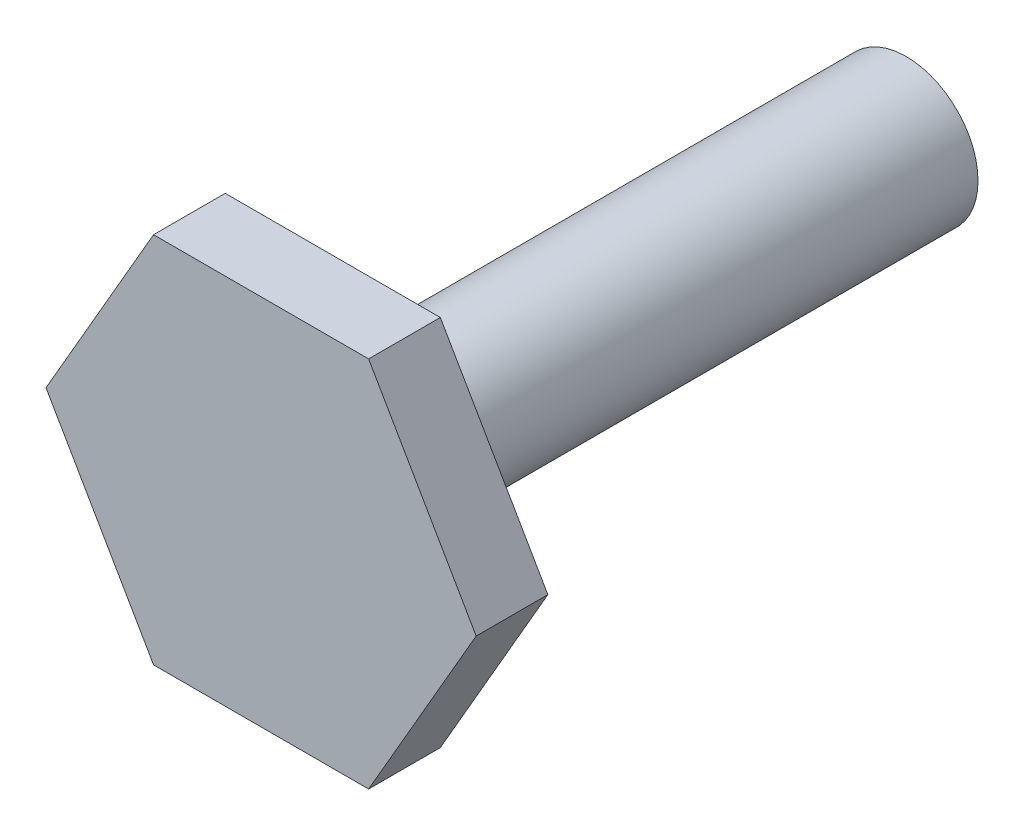
ISO-10303-21;
HEADER;
FILE_DESCRIPTION(('STEP AP214'),'2;1');
FILE_NAME('part.step','',(''),(''),'','','');
FILE_SCHEMA(('AUTOMOTIVE_DESIGN { 1 0 10303 214 1 1 1 1 }'));
ENDSEC;
DATA;
#1=APPLICATION_CONTEXT('core data for automotive mechanical design processes');
#2=APPLICATION_PROTOCOL_DEFINITION('international standard','automotive_design',2000,#1);
#3=PRODUCT_CONTEXT('',#1,'mechanical');
#4=PRODUCT('Part','Part','',(#3));
#5=PRODUCT_RELATED_PRODUCT_CATEGORY('part','',(#4));
#6=PRODUCT_DEFINITION_FORMATION('','',#4);
#7=PRODUCT_DEFINITION_CONTEXT('part definition',#1,'design');
#8=PRODUCT_DEFINITION('design','',#6,#7);
#9=PRODUCT_DEFINITION_SHAPE('','',#8);
#10=(LENGTH_UNIT() NAMED_UNIT(*) SI_UNIT(.MILLI.,.METRE.));
#11=(NAMED_UNIT(*) PLANE_ANGLE_UNIT() SI_UNIT($,.RADIAN.));
#12=(NAMED_UNIT(*) SI_UNIT($,.STERADIAN.) SOLID_ANGLE_UNIT());
#13=UNCERTAINTY_MEASURE_WITH_UNIT(LENGTH_MEASURE(1.E-05),#10,'distance_accuracy_value','');
#14=(GEOMETRIC_REPRESENTATION_CONTEXT(3) GLOBAL_UNCERTAINTY_ASSIGNED_CONTEXT((#13)) GLOBAL_UNIT_ASSIGNED_CONTEXT((#10,
#11,#12)) REPRESENTATION_CONTEXT('',''));
#15=CARTESIAN_POINT('',(0.,0.,0.));
#16=DIRECTION('',(0.,0.,1.));
#17=DIRECTION('',(1.,0.,0.));
#18=AXIS2_PLACEMENT_3D('',#15,#16,#17);
#19=CARTESIAN_POINT('',(0.,0.,12.7));
#20=DIRECTION('',(0.,0.,-1.));
#21=DIRECTION('',(-1.,0.,0.));
#22=AXIS2_PLACEMENT_3D('',#19,#20,#21);
#23=CYLINDRICAL_SURFACE('',#22,3.175);
#24=CARTESIAN_POINT('',(0.,0.,12.7));
#25=DIRECTION('',(0.,0.,1.));
#26=DIRECTION('',(1.,0.,0.));
#27=AXIS2_PLACEMENT_3D('',#24,#25,#26);
#28=CIRCLE('',#27,3.175);
#29=CARTESIAN_POINT('',(3.175,0.,12.7));
#30=VERTEX_POINT('',#29);
#31=EDGE_CURVE('E11',#30,#30,#28,.T.);
#32=ORIENTED_EDGE('',*,*,#31,.F.);
#33=EDGE_LOOP('',(#32));
#34=FACE_BOUND('',#33,.T.);
#35=CARTESIAN_POINT('',(0.,0.,-12.7));
#36=DIRECTION('',(0.,0.,1.));
#37=DIRECTION('',(1.,0.,0.));
#38=AXIS2_PLACEMENT_3D('',#35,#36,#37);
#39=CIRCLE('',#38,3.175);
#40=CARTESIAN_POINT('',(3.175,0.,-12.7));
#41=VERTEX_POINT('',#40);
#42=EDGE_CURVE('E48',#41,#41,#39,.T.);
#43=ORIENTED_EDGE('',*,*,#42,.T.);
#44=EDGE_LOOP('',(#43));
#45=FACE_BOUND('',#44,.T.);
#46=ADVANCED_FACE('F45',(#34,#45),#23,.T.);
#47=CARTESIAN_POINT('',(0.,0.,-12.7));
#48=DIRECTION('',(0.,0.,1.));
#49=DIRECTION('',(1.,0.,0.));
#50=AXIS2_PLACEMENT_3D('',#47,#48,#49);
#51=PLANE('',#50);
#52=ORIENTED_EDGE('',*,*,#42,.F.);
#53=EDGE_LOOP('',(#52));
#54=FACE_BOUND('',#53,.T.);
#55=ADVANCED_FACE('F170',(#54),#51,.F.);
#56=CARTESIAN_POINT('',(4.7625,-8.24889197104678,15.875));
#57=DIRECTION('',(-0.866025403784439,0.5,0.));
#58=DIRECTION('',(-0.5,-0.866025403784439,0.));
#59=AXIS2_PLACEMENT_3D('',#56,#57,#58);
#60=PLANE('',#59);
#61=DIRECTION('',(0.5,0.866025403784439,0.));
#62=VECTOR('',#61,1.);
#63=CARTESIAN_POINT('',(4.7625,-8.24889197104678,12.7));
#64=LINE('',#63,#62);
#65=CARTESIAN_POINT('',(4.7625,-8.24889197104678,12.7));
#66=VERTEX_POINT('',#65);
#67=CARTESIAN_POINT('',(9.525,0.,12.7));
#68=VERTEX_POINT('',#67);
#69=EDGE_CURVE('E135',#66,#68,#64,.T.);
#70=ORIENTED_EDGE('',*,*,#69,.T.);
#71=DIRECTION('',(0.,0.,-1.));
#72=VECTOR('',#71,1.);
#73=CARTESIAN_POINT('',(9.525,0.,15.875));
#74=LINE('',#73,#72);
#75=CARTESIAN_POINT('',(9.525,0.,15.875));
#76=VERTEX_POINT('',#75);
#77=EDGE_CURVE('E162',#76,#68,#74,.T.);
#78=ORIENTED_EDGE('',*,*,#77,.F.);
#79=DIRECTION('',(0.5,0.866025403784439,0.));
#80=VECTOR('',#79,1.);
#81=CARTESIAN_POINT('',(4.7625,-8.24889197104678,15.875));
#82=LINE('',#81,#80);
#83=CARTESIAN_POINT('',(4.7625,-8.24889197104678,15.875));
#84=VERTEX_POINT('',#83);
#85=EDGE_CURVE('E151',#84,#76,#82,.T.);
#86=ORIENTED_EDGE('',*,*,#85,.F.);
#87=DIRECTION('',(0.,0.,-1.));
#88=VECTOR('',#87,1.);
#89=CARTESIAN_POINT('',(4.7625,-8.24889197104678,15.875));
#90=LINE('',#89,#88);
#91=EDGE_CURVE('E131',#84,#66,#90,.T.);
#92=ORIENTED_EDGE('',*,*,#91,.T.);
#93=EDGE_LOOP('',(#70,#78,#86,#92));
#94=FACE_BOUND('',#93,.T.);
#95=ADVANCED_FACE('F172',(#94),#60,.F.);
#96=CARTESIAN_POINT('',(9.525,0.,15.875));
#97=DIRECTION('',(-0.866025403784439,-0.5,0.));
#98=DIRECTION('',(0.5,-0.866025403784439,0.));
#99=AXIS2_PLACEMENT_3D('',#96,#97,#98);
#100=PLANE('',#99);
#101=DIRECTION('',(-0.5,0.866025403784439,0.));
#102=VECTOR('',#101,1.);
#103=CARTESIAN_POINT('',(9.525,0.,12.7));
#104=LINE('',#103,#102);
#105=CARTESIAN_POINT('',(4.7625,8.24889197104678,12.7));
#106=VERTEX_POINT('',#105);
#107=EDGE_CURVE('E139',#68,#106,#104,.T.);
#108=ORIENTED_EDGE('',*,*,#107,.T.);
#109=DIRECTION('',(0.,0.,-1.));
#110=VECTOR('',#109,1.);
#111=CARTESIAN_POINT('',(4.7625,8.24889197104678,15.875));
#112=LINE('',#111,#110);
#113=CARTESIAN_POINT('',(4.7625,8.24889197104678,15.875));
#114=VERTEX_POINT('',#113);
#115=EDGE_CURVE('E158',#114,#106,#112,.T.);
#116=ORIENTED_EDGE('',*,*,#115,.F.);
#117=DIRECTION('',(-0.5,0.866025403784439,0.));
#118=VECTOR('',#117,1.);
#119=CARTESIAN_POINT('',(9.525,0.,15.875));
#120=LINE('',#119,#118);
#121=EDGE_CURVE('E100',#76,#114,#120,.T.);
#122=ORIENTED_EDGE('',*,*,#121,.F.);
#123=ORIENTED_EDGE('',*,*,#77,.T.);
#124=EDGE_LOOP('',(#108,#116,#122,#123));
#125=FACE_BOUND('',#124,.T.);
#126=ADVANCED_FACE('F177',(#125),#100,.F.);
#127=CARTESIAN_POINT('',(4.7625,8.24889197104678,15.875));
#128=DIRECTION('',(0.,-1.,0.));
#129=DIRECTION('',(0.,0.,-1.));
#130=AXIS2_PLACEMENT_3D('',#127,#128,#129);
#131=PLANE('',#130);
#132=DIRECTION('',(-1.,0.,0.));
#133=VECTOR('',#132,1.);
#134=CARTESIAN_POINT('',(4.7625,8.24889197104678,12.7));
#135=LINE('',#134,#133);
#136=CARTESIAN_POINT('',(-4.7625,8.24889197104678,12.7));
#137=VERTEX_POINT('',#136);
#138=EDGE_CURVE('E142',#106,#137,#135,.T.);
#139=ORIENTED_EDGE('',*,*,#138,.T.);
#140=DIRECTION('',(0.,0.,-1.));
#141=VECTOR('',#140,1.);
#142=CARTESIAN_POINT('',(-4.7625,8.24889197104678,15.875));
#143=LINE('',#142,#141);
#144=CARTESIAN_POINT('',(-4.7625,8.24889197104678,15.875));
#145=VERTEX_POINT('',#144);
#146=EDGE_CURVE('E124',#145,#137,#143,.T.);
#147=ORIENTED_EDGE('',*,*,#146,.F.);
#148=DIRECTION('',(-1.,0.,0.));
#149=VECTOR('',#148,1.);
#150=CARTESIAN_POINT('',(4.7625,8.24889197104678,15.875));
#151=LINE('',#150,#149);
#152=EDGE_CURVE('E113',#114,#145,#151,.T.);
#153=ORIENTED_EDGE('',*,*,#152,.F.);
#154=ORIENTED_EDGE('',*,*,#115,.T.);
#155=EDGE_LOOP('',(#139,#147,#153,#154));
#156=FACE_BOUND('',#155,.T.);
#157=ADVANCED_FACE('F184',(#156),#131,.F.);
#158=CARTESIAN_POINT('',(-4.7625,8.24889197104678,15.875));
#159=DIRECTION('',(0.866025403784439,-0.5,0.));
#160=DIRECTION('',(0.5,0.866025403784439,0.));
#161=AXIS2_PLACEMENT_3D('',#158,#159,#160);
#162=PLANE('',#161);
#163=DIRECTION('',(-0.5,-0.866025403784439,0.));
#164=VECTOR('',#163,1.);
#165=CARTESIAN_POINT('',(-4.7625,8.24889197104678,12.7));
#166=LINE('',#165,#164);
#167=CARTESIAN_POINT('',(-9.525,0.,12.7));
#168=VERTEX_POINT('',#167);
#169=EDGE_CURVE('E122',#137,#168,#166,.T.);
#170=ORIENTED_EDGE('',*,*,#169,.T.);
#171=DIRECTION('',(0.,0.,-1.));
#172=VECTOR('',#171,1.);
#173=CARTESIAN_POINT('',(-9.525,0.,15.875));
#174=LINE('',#173,#172);
#175=CARTESIAN_POINT('',(-9.525,0.,15.875));
#176=VERTEX_POINT('',#175);
#177=EDGE_CURVE('E119',#176,#168,#174,.T.);
#178=ORIENTED_EDGE('',*,*,#177,.F.);
#179=DIRECTION('',(-0.5,-0.866025403784439,0.));
#180=VECTOR('',#179,1.);
#181=CARTESIAN_POINT('',(-4.7625,8.24889197104678,15.875));
#182=LINE('',#181,#180);
#183=EDGE_CURVE('E107',#145,#176,#182,.T.);
#184=ORIENTED_EDGE('',*,*,#183,.F.);
#185=ORIENTED_EDGE('',*,*,#146,.T.);
#186=EDGE_LOOP('',(#170,#178,#184,#185));
#187=FACE_BOUND('',#186,.T.);
#188=ADVANCED_FACE('F120',(#187),#162,.F.);
#189=CARTESIAN_POINT('',(-9.525,0.,15.875));
#190=DIRECTION('',(0.866025403784439,0.5,0.));
#191=DIRECTION('',(-0.5,0.866025403784439,0.));
#192=AXIS2_PLACEMENT_3D('',#189,#190,#191);
#193=PLANE('',#192);
#194=DIRECTION('',(0.5,-0.866025403784439,0.));
#195=VECTOR('',#194,1.);
#196=CARTESIAN_POINT('',(-9.525,0.,12.7));
#197=LINE('',#196,#195);
#198=CARTESIAN_POINT('',(-4.7625,-8.24889197104678,12.7));
#199=VERTEX_POINT('',#198);
#200=EDGE_CURVE('E85',#168,#199,#197,.T.);
#201=ORIENTED_EDGE('',*,*,#200,.T.);
#202=DIRECTION('',(0.,0.,-1.));
#203=VECTOR('',#202,1.);
#204=CARTESIAN_POINT('',(-4.7625,-8.24889197104678,15.875));
#205=LINE('',#204,#203);
#206=CARTESIAN_POINT('',(-4.7625,-8.24889197104678,15.875));
#207=VERTEX_POINT('',#206);
#208=EDGE_CURVE('E125',#207,#199,#205,.T.);
#209=ORIENTED_EDGE('',*,*,#208,.F.);
#210=DIRECTION('',(0.5,-0.866025403784439,0.));
#211=VECTOR('',#210,1.);
#212=CARTESIAN_POINT('',(-9.525,0.,15.875));
#213=LINE('',#212,#211);
#214=EDGE_CURVE('E111',#176,#207,#213,.T.);
#215=ORIENTED_EDGE('',*,*,#214,.F.);
#216=ORIENTED_EDGE('',*,*,#177,.T.);
#217=EDGE_LOOP('',(#201,#209,#215,#216));
#218=FACE_BOUND('',#217,.T.);
#219=ADVANCED_FACE('F127',(#218),#193,.F.);
#220=CARTESIAN_POINT('',(-4.7625,-8.24889197104678,15.875));
#221=DIRECTION('',(0.,1.,0.));
#222=DIRECTION('',(-1.,0.,0.));
#223=AXIS2_PLACEMENT_3D('',#220,#221,#222);
#224=PLANE('',#223);
#225=DIRECTION('',(1.,0.,0.));
#226=VECTOR('',#225,1.);
#227=CARTESIAN_POINT('',(-4.7625,-8.24889197104678,12.7));
#228=LINE('',#227,#226);
#229=EDGE_CURVE('E91',#199,#66,#228,.T.);
#230=ORIENTED_EDGE('',*,*,#229,.T.);
#231=ORIENTED_EDGE('',*,*,#91,.F.);
#232=DIRECTION('',(1.,0.,0.));
#233=VECTOR('',#232,1.);
#234=CARTESIAN_POINT('',(-4.7625,-8.24889197104678,15.875));
#235=LINE('',#234,#233);
#236=EDGE_CURVE('E62',#207,#84,#235,.T.);
#237=ORIENTED_EDGE('',*,*,#236,.F.);
#238=ORIENTED_EDGE('',*,*,#208,.T.);
#239=EDGE_LOOP('',(#230,#231,#237,#238));
#240=FACE_BOUND('',#239,.T.);
#241=ADVANCED_FACE('F192',(#240),#224,.F.);
#242=CARTESIAN_POINT('',(0.,0.,15.875));
#243=DIRECTION('',(0.,0.,1.));
#244=DIRECTION('',(1.,0.,0.));
#245=AXIS2_PLACEMENT_3D('',#242,#243,#244);
#246=PLANE('',#245);
#247=ORIENTED_EDGE('',*,*,#85,.T.);
#248=ORIENTED_EDGE('',*,*,#121,.T.);
#249=ORIENTED_EDGE('',*,*,#152,.T.);
#250=ORIENTED_EDGE('',*,*,#183,.T.);
#251=ORIENTED_EDGE('',*,*,#214,.T.);
#252=ORIENTED_EDGE('',*,*,#236,.T.);
#253=EDGE_LOOP('',(#247,#248,#249,#250,#251,#252));
#254=FACE_BOUND('',#253,.T.);
#255=ADVANCED_FACE('F109',(#254),#246,.T.);
#256=CARTESIAN_POINT('',(0.,0.,12.7));
#257=DIRECTION('',(0.,0.,1.));
#258=DIRECTION('',(1.,0.,0.));
#259=AXIS2_PLACEMENT_3D('',#256,#257,#258);
#260=PLANE('',#259);
#261=ORIENTED_EDGE('',*,*,#31,.T.);
#262=EDGE_LOOP('',(#261));
#263=FACE_BOUND('',#262,.T.);
#264=ORIENTED_EDGE('',*,*,#69,.F.);
#265=ORIENTED_EDGE('',*,*,#229,.F.);
#266=ORIENTED_EDGE('',*,*,#200,.F.);
#267=ORIENTED_EDGE('',*,*,#169,.F.);
#268=ORIENTED_EDGE('',*,*,#138,.F.);
#269=ORIENTED_EDGE('',*,*,#107,.F.);
#270=EDGE_LOOP('',(#264,#265,#266,#267,#268,#269));
#271=FACE_BOUND('',#270,.T.);
#272=ADVANCED_FACE('F195',(#263,#271),#260,.F.);
#273=CLOSED_SHELL('',(#46,#55,#95,#126,#157,#188,#219,#241,#255,#272));
#274=MANIFOLD_SOLID_BREP('B2',#273);
#275=ADVANCED_BREP_SHAPE_REPRESENTATION('',(#18,#274),#14);
#276=SHAPE_DEFINITION_REPRESENTATION(#9,#275);
ENDSEC;
END-ISO-10303-21;
